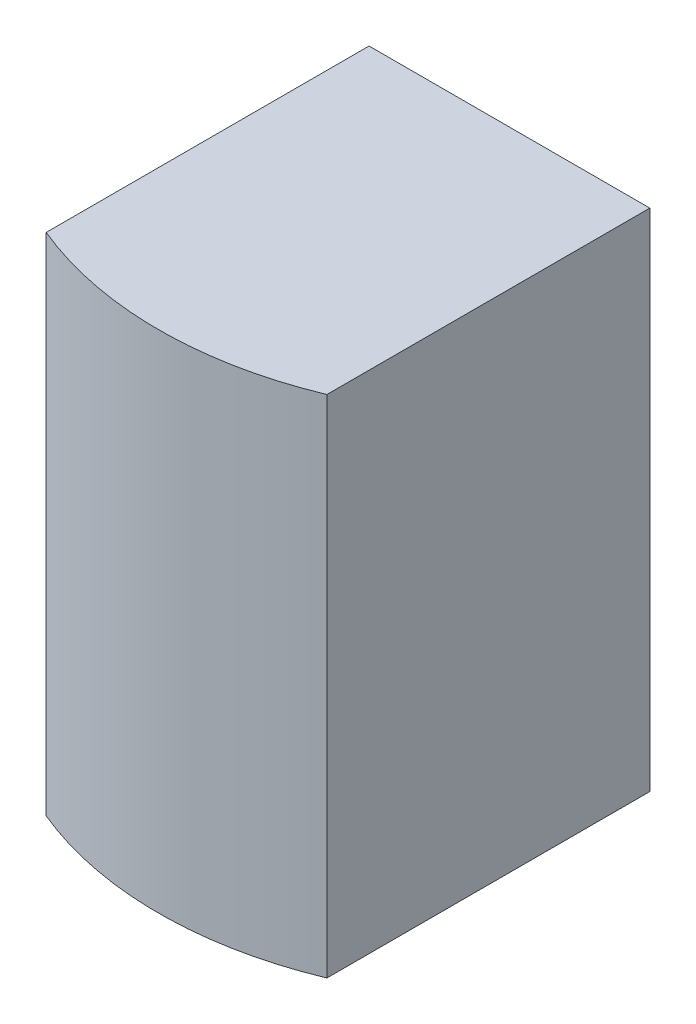
ISO-10303-21;
HEADER;
FILE_DESCRIPTION(('STEP AP214'),'2;1');
FILE_NAME('part.step','',(''),(''),'','','');
FILE_SCHEMA(('AUTOMOTIVE_DESIGN { 1 0 10303 214 1 1 1 1 }'));
ENDSEC;
DATA;
#1=APPLICATION_CONTEXT('core data for automotive mechanical design processes');
#2=APPLICATION_PROTOCOL_DEFINITION('international standard','automotive_design',2000,#1);
#3=PRODUCT_CONTEXT('',#1,'mechanical');
#4=PRODUCT('Part','Part','',(#3));
#5=PRODUCT_RELATED_PRODUCT_CATEGORY('part','',(#4));
#6=PRODUCT_DEFINITION_FORMATION('','',#4);
#7=PRODUCT_DEFINITION_CONTEXT('part definition',#1,'design');
#8=PRODUCT_DEFINITION('design','',#6,#7);
#9=PRODUCT_DEFINITION_SHAPE('','',#8);
#10=(LENGTH_UNIT() NAMED_UNIT(*) SI_UNIT(.MILLI.,.METRE.));
#11=(NAMED_UNIT(*) PLANE_ANGLE_UNIT() SI_UNIT($,.RADIAN.));
#12=(NAMED_UNIT(*) SI_UNIT($,.STERADIAN.) SOLID_ANGLE_UNIT());
#13=UNCERTAINTY_MEASURE_WITH_UNIT(LENGTH_MEASURE(1.E-05),#10,'distance_accuracy_value','');
#14=(GEOMETRIC_REPRESENTATION_CONTEXT(3) GLOBAL_UNCERTAINTY_ASSIGNED_CONTEXT((#13)) GLOBAL_UNIT_ASSIGNED_CONTEXT((#10,
#11,#12)) REPRESENTATION_CONTEXT('',''));
#15=CARTESIAN_POINT('',(0.,0.,0.));
#16=DIRECTION('',(0.,0.,1.));
#17=DIRECTION('',(1.,0.,0.));
#18=AXIS2_PLACEMENT_3D('',#15,#16,#17);
#19=CARTESIAN_POINT('',(-1.,-1.8,0.));
#20=DIRECTION('',(-1.,0.,0.));
#21=DIRECTION('',(0.,0.,1.));
#22=AXIS2_PLACEMENT_3D('',#19,#20,#21);
#23=PLANE('',#22);
#24=DIRECTION('',(0.,1.,0.));
#25=VECTOR('',#24,1.);
#26=CARTESIAN_POINT('',(-1.,0.,0.));
#27=LINE('',#26,#25);
#28=CARTESIAN_POINT('',(-1.,1.8,0.));
#29=VERTEX_POINT('',#28);
#30=CARTESIAN_POINT('',(-1.,-1.8,0.));
#31=VERTEX_POINT('',#30);
#32=EDGE_CURVE('E91',#29,#31,#27,.F.);
#33=ORIENTED_EDGE('',*,*,#32,.T.);
#34=DIRECTION('',(0.,0.,-1.));
#35=VECTOR('',#34,1.);
#36=CARTESIAN_POINT('',(-1.,-1.8,0.));
#37=LINE('',#36,#35);
#38=CARTESIAN_POINT('',(-1.,-1.8,2.3));
#39=VERTEX_POINT('',#38);
#40=EDGE_CURVE('E64',#39,#31,#37,.T.);
#41=ORIENTED_EDGE('',*,*,#40,.F.);
#42=DIRECTION('',(0.,1.,0.));
#43=VECTOR('',#42,1.);
#44=CARTESIAN_POINT('',(-1.,-1.8,2.3));
#45=LINE('',#44,#43);
#46=CARTESIAN_POINT('',(-1.,1.8,2.3));
#47=VERTEX_POINT('',#46);
#48=EDGE_CURVE('E60',#47,#39,#45,.F.);
#49=ORIENTED_EDGE('',*,*,#48,.F.);
#50=DIRECTION('',(0.,0.,1.));
#51=VECTOR('',#50,1.);
#52=CARTESIAN_POINT('',(-1.,1.8,0.));
#53=LINE('',#52,#51);
#54=EDGE_CURVE('E74',#29,#47,#53,.T.);
#55=ORIENTED_EDGE('',*,*,#54,.F.);
#56=EDGE_LOOP('',(#33,#41,#49,#55));
#57=FACE_BOUND('',#56,.T.);
#58=ADVANCED_FACE('F16',(#57),#23,.T.);
#59=CARTESIAN_POINT('',(0.,-1.8,-0.099999999999996));
#60=DIRECTION('',(0.,1.,0.));
#61=DIRECTION('',(-1.,0.,0.));
#62=AXIS2_PLACEMENT_3D('',#59,#60,#61);
#63=CYLINDRICAL_SURFACE('',#62,2.6);
#64=CARTESIAN_POINT('',(0.,-1.8,-0.099999999999996));
#65=DIRECTION('',(0.,1.,0.));
#66=DIRECTION('',(-1.,0.,0.));
#67=AXIS2_PLACEMENT_3D('',#64,#65,#66);
#68=CIRCLE('',#67,2.6);
#69=CARTESIAN_POINT('',(1.,-1.8,2.3));
#70=VERTEX_POINT('',#69);
#71=EDGE_CURVE('E19',#70,#39,#68,.F.);
#72=ORIENTED_EDGE('',*,*,#71,.F.);
#73=DIRECTION('',(0.,1.,0.));
#74=VECTOR('',#73,1.);
#75=CARTESIAN_POINT('',(1.,1.8,2.3));
#76=LINE('',#75,#74);
#77=CARTESIAN_POINT('',(1.,1.8,2.3));
#78=VERTEX_POINT('',#77);
#79=EDGE_CURVE('E58',#78,#70,#76,.F.);
#80=ORIENTED_EDGE('',*,*,#79,.F.);
#81=CARTESIAN_POINT('',(0.,1.8,-0.099999999999996));
#82=DIRECTION('',(0.,1.,0.));
#83=DIRECTION('',(-1.,0.,0.));
#84=AXIS2_PLACEMENT_3D('',#81,#82,#83);
#85=CIRCLE('',#84,2.6);
#86=EDGE_CURVE('E84',#47,#78,#85,.T.);
#87=ORIENTED_EDGE('',*,*,#86,.F.);
#88=ORIENTED_EDGE('',*,*,#48,.T.);
#89=EDGE_LOOP('',(#72,#80,#87,#88));
#90=FACE_BOUND('',#89,.T.);
#91=ADVANCED_FACE('F55',(#90),#63,.T.);
#92=CARTESIAN_POINT('',(1.,-1.8,0.));
#93=DIRECTION('',(0.,-1.,0.));
#94=DIRECTION('',(0.,0.,-1.));
#95=AXIS2_PLACEMENT_3D('',#92,#93,#94);
#96=PLANE('',#95);
#97=DIRECTION('',(1.,0.,0.));
#98=VECTOR('',#97,1.);
#99=CARTESIAN_POINT('',(0.,-1.8,0.));
#100=LINE('',#99,#98);
#101=CARTESIAN_POINT('',(1.,-1.8,0.));
#102=VERTEX_POINT('',#101);
#103=EDGE_CURVE('E69',#31,#102,#100,.T.);
#104=ORIENTED_EDGE('',*,*,#103,.T.);
#105=DIRECTION('',(0.,0.,-1.));
#106=VECTOR('',#105,1.);
#107=CARTESIAN_POINT('',(1.,-1.8,0.));
#108=LINE('',#107,#106);
#109=EDGE_CURVE('E66',#70,#102,#108,.T.);
#110=ORIENTED_EDGE('',*,*,#109,.F.);
#111=ORIENTED_EDGE('',*,*,#71,.T.);
#112=ORIENTED_EDGE('',*,*,#40,.T.);
#113=EDGE_LOOP('',(#104,#110,#111,#112));
#114=FACE_BOUND('',#113,.T.);
#115=ADVANCED_FACE('F67',(#114),#96,.T.);
#116=CARTESIAN_POINT('',(0.,0.,0.));
#117=DIRECTION('',(0.,0.,1.));
#118=DIRECTION('',(1.,0.,0.));
#119=AXIS2_PLACEMENT_3D('',#116,#117,#118);
#120=PLANE('',#119);
#121=DIRECTION('',(0.,1.,0.));
#122=VECTOR('',#121,1.);
#123=CARTESIAN_POINT('',(1.,1.8,0.));
#124=LINE('',#123,#122);
#125=CARTESIAN_POINT('',(1.,1.8,0.));
#126=VERTEX_POINT('',#125);
#127=EDGE_CURVE('E25',#102,#126,#124,.T.);
#128=ORIENTED_EDGE('',*,*,#127,.F.);
#129=ORIENTED_EDGE('',*,*,#103,.F.);
#130=ORIENTED_EDGE('',*,*,#32,.F.);
#131=DIRECTION('',(1.,0.,0.));
#132=VECTOR('',#131,1.);
#133=CARTESIAN_POINT('',(-1.,1.8,0.));
#134=LINE('',#133,#132);
#135=EDGE_CURVE('E34',#126,#29,#134,.F.);
#136=ORIENTED_EDGE('',*,*,#135,.F.);
#137=EDGE_LOOP('',(#128,#129,#130,#136));
#138=FACE_BOUND('',#137,.T.);
#139=ADVANCED_FACE('F106',(#138),#120,.F.);
#140=CARTESIAN_POINT('',(-1.,1.8,0.));
#141=DIRECTION('',(0.,1.,0.));
#142=DIRECTION('',(0.,0.,1.));
#143=AXIS2_PLACEMENT_3D('',#140,#141,#142);
#144=PLANE('',#143);
#145=ORIENTED_EDGE('',*,*,#135,.T.);
#146=ORIENTED_EDGE('',*,*,#54,.T.);
#147=ORIENTED_EDGE('',*,*,#86,.T.);
#148=DIRECTION('',(0.,0.,-1.));
#149=VECTOR('',#148,1.);
#150=CARTESIAN_POINT('',(1.,1.8,0.));
#151=LINE('',#150,#149);
#152=EDGE_CURVE('E11',#126,#78,#151,.F.);
#153=ORIENTED_EDGE('',*,*,#152,.F.);
#154=EDGE_LOOP('',(#145,#146,#147,#153));
#155=FACE_BOUND('',#154,.T.);
#156=ADVANCED_FACE('F103',(#155),#144,.T.);
#157=CARTESIAN_POINT('',(1.,1.8,0.));
#158=DIRECTION('',(1.,0.,0.));
#159=DIRECTION('',(0.,0.,-1.));
#160=AXIS2_PLACEMENT_3D('',#157,#158,#159);
#161=PLANE('',#160);
#162=ORIENTED_EDGE('',*,*,#127,.T.);
#163=ORIENTED_EDGE('',*,*,#152,.T.);
#164=ORIENTED_EDGE('',*,*,#79,.T.);
#165=ORIENTED_EDGE('',*,*,#109,.T.);
#166=EDGE_LOOP('',(#162,#163,#164,#165));
#167=FACE_BOUND('',#166,.T.);
#168=ADVANCED_FACE('F73',(#167),#161,.T.);
#169=CLOSED_SHELL('',(#58,#91,#115,#139,#156,#168));
#170=MANIFOLD_SOLID_BREP('B1',#169);
#171=ADVANCED_BREP_SHAPE_REPRESENTATION('',(#18,#170),#14);
#172=SHAPE_DEFINITION_REPRESENTATION(#9,#171);
ENDSEC;
END-ISO-10303-21;
